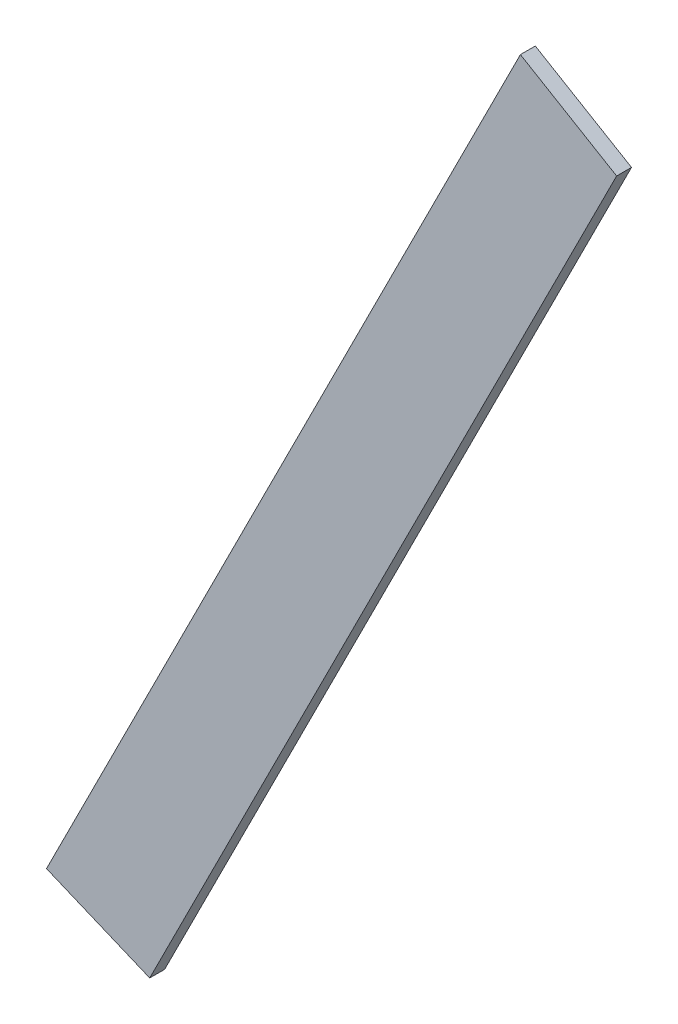
ISO-10303-21;
HEADER;
FILE_DESCRIPTION(('STEP AP214'),'2;1');
FILE_NAME('part.step','',(''),(''),'','','');
FILE_SCHEMA(('AUTOMOTIVE_DESIGN { 1 0 10303 214 1 1 1 1 }'));
ENDSEC;
DATA;
#1=APPLICATION_CONTEXT('core data for automotive mechanical design processes');
#2=APPLICATION_PROTOCOL_DEFINITION('international standard','automotive_design',2000,#1);
#3=PRODUCT_CONTEXT('',#1,'mechanical');
#4=PRODUCT('Part','Part','',(#3));
#5=PRODUCT_RELATED_PRODUCT_CATEGORY('part','',(#4));
#6=PRODUCT_DEFINITION_FORMATION('','',#4);
#7=PRODUCT_DEFINITION_CONTEXT('part definition',#1,'design');
#8=PRODUCT_DEFINITION('design','',#6,#7);
#9=PRODUCT_DEFINITION_SHAPE('','',#8);
#10=(LENGTH_UNIT() NAMED_UNIT(*) SI_UNIT(.MILLI.,.METRE.));
#11=(NAMED_UNIT(*) PLANE_ANGLE_UNIT() SI_UNIT($,.RADIAN.));
#12=(NAMED_UNIT(*) SI_UNIT($,.STERADIAN.) SOLID_ANGLE_UNIT());
#13=UNCERTAINTY_MEASURE_WITH_UNIT(LENGTH_MEASURE(1.E-05),#10,'distance_accuracy_value','');
#14=(GEOMETRIC_REPRESENTATION_CONTEXT(3) GLOBAL_UNCERTAINTY_ASSIGNED_CONTEXT((#13)) GLOBAL_UNIT_ASSIGNED_CONTEXT((#10,
#11,#12)) REPRESENTATION_CONTEXT('',''));
#15=CARTESIAN_POINT('',(0.,0.,0.));
#16=DIRECTION('',(0.,0.,1.));
#17=DIRECTION('',(1.,0.,0.));
#18=AXIS2_PLACEMENT_3D('',#15,#16,#17);
#19=CARTESIAN_POINT('',(31.4175872037386,-12.775658974795,2.));
#20=DIRECTION('',(-0.893304928541923,0.449451114853117,0.));
#21=DIRECTION('',(-0.449451114853117,-0.893304928541923,0.));
#22=AXIS2_PLACEMENT_3D('',#19,#20,#21);
#23=PLANE('',#22);
#24=DIRECTION('',(0.449451114853117,0.893304928541923,0.));
#25=VECTOR('',#24,1.);
#26=CARTESIAN_POINT('',(31.4175872037386,-12.775658974795,0.));
#27=LINE('',#26,#25);
#28=CARTESIAN_POINT('',(31.4175872037386,-12.775658974795,0.));
#29=VERTEX_POINT('',#28);
#30=CARTESIAN_POINT('',(94.186115232343,111.97970060107,0.));
#31=VERTEX_POINT('',#30);
#32=EDGE_CURVE('E96',#29,#31,#27,.T.);
#33=ORIENTED_EDGE('',*,*,#32,.T.);
#34=DIRECTION('',(0.,0.,-1.));
#35=VECTOR('',#34,1.);
#36=CARTESIAN_POINT('',(94.186115232343,111.97970060107,2.));
#37=LINE('',#36,#35);
#38=CARTESIAN_POINT('',(94.186115232343,111.97970060107,2.));
#39=VERTEX_POINT('',#38);
#40=EDGE_CURVE('E11',#39,#31,#37,.T.);
#41=ORIENTED_EDGE('',*,*,#40,.F.);
#42=DIRECTION('',(0.449451114853117,0.893304928541923,0.));
#43=VECTOR('',#42,1.);
#44=CARTESIAN_POINT('',(31.4175872037386,-12.775658974795,2.));
#45=LINE('',#44,#43);
#46=CARTESIAN_POINT('',(31.4175872037386,-12.775658974795,2.));
#47=VERTEX_POINT('',#46);
#48=EDGE_CURVE('E84',#47,#39,#45,.T.);
#49=ORIENTED_EDGE('',*,*,#48,.F.);
#50=DIRECTION('',(0.,0.,-1.));
#51=VECTOR('',#50,1.);
#52=CARTESIAN_POINT('',(31.4175872037386,-12.775658974795,2.));
#53=LINE('',#52,#51);
#54=EDGE_CURVE('E92',#47,#29,#53,.T.);
#55=ORIENTED_EDGE('',*,*,#54,.T.);
#56=EDGE_LOOP('',(#33,#41,#49,#55));
#57=FACE_BOUND('',#56,.T.);
#58=ADVANCED_FACE('F33',(#57),#23,.F.);
#59=CARTESIAN_POINT('',(94.186115232343,111.97970060107,2.));
#60=DIRECTION('',(-0.509923374683296,-0.86021982769034,0.));
#61=DIRECTION('',(0.86021982769034,-0.509923374683296,0.));
#62=AXIS2_PLACEMENT_3D('',#59,#60,#61);
#63=PLANE('',#62);
#64=DIRECTION('',(-0.86021982769034,0.509923374683296,0.));
#65=VECTOR('',#64,1.);
#66=CARTESIAN_POINT('',(94.186115232343,111.97970060107,0.));
#67=LINE('',#66,#65);
#68=CARTESIAN_POINT('',(81.2520896887023,119.646766322122,0.));
#69=VERTEX_POINT('',#68);
#70=EDGE_CURVE('E88',#31,#69,#67,.T.);
#71=ORIENTED_EDGE('',*,*,#70,.T.);
#72=DIRECTION('',(0.,0.,-1.));
#73=VECTOR('',#72,1.);
#74=CARTESIAN_POINT('',(81.2520896887023,119.646766322122,2.));
#75=LINE('',#74,#73);
#76=CARTESIAN_POINT('',(81.2520896887023,119.646766322122,2.));
#77=VERTEX_POINT('',#76);
#78=EDGE_CURVE('E41',#77,#69,#75,.T.);
#79=ORIENTED_EDGE('',*,*,#78,.F.);
#80=DIRECTION('',(-0.86021982769034,0.509923374683296,0.));
#81=VECTOR('',#80,1.);
#82=CARTESIAN_POINT('',(94.186115232343,111.97970060107,2.));
#83=LINE('',#82,#81);
#84=EDGE_CURVE('E79',#39,#77,#83,.T.);
#85=ORIENTED_EDGE('',*,*,#84,.F.);
#86=ORIENTED_EDGE('',*,*,#40,.T.);
#87=EDGE_LOOP('',(#71,#79,#85,#86));
#88=FACE_BOUND('',#87,.T.);
#89=ADVANCED_FACE('F87',(#88),#63,.F.);
#90=CARTESIAN_POINT('',(17.5407004382396,-6.98257364578779,2.));
#91=DIRECTION('',(0.893304928541923,-0.449451114853117,0.));
#92=DIRECTION('',(0.449451114853117,0.893304928541923,0.));
#93=AXIS2_PLACEMENT_3D('',#90,#91,#92);
#94=PLANE('',#93);
#95=DIRECTION('',(-0.449451114853117,-0.893304928541923,0.));
#96=VECTOR('',#95,1.);
#97=CARTESIAN_POINT('',(17.5407004382396,-6.98257364578779,0.));
#98=LINE('',#97,#96);
#99=CARTESIAN_POINT('',(17.5407004382396,-6.98257364578779,0.));
#100=VERTEX_POINT('',#99);
#101=EDGE_CURVE('E66',#69,#100,#98,.T.);
#102=ORIENTED_EDGE('',*,*,#101,.T.);
#103=DIRECTION('',(0.,0.,-1.));
#104=VECTOR('',#103,1.);
#105=CARTESIAN_POINT('',(17.5407004382396,-6.98257364578779,2.));
#106=LINE('',#105,#104);
#107=CARTESIAN_POINT('',(17.5407004382396,-6.98257364578779,2.));
#108=VERTEX_POINT('',#107);
#109=EDGE_CURVE('E89',#108,#100,#106,.T.);
#110=ORIENTED_EDGE('',*,*,#109,.F.);
#111=DIRECTION('',(-0.449451114853117,-0.893304928541923,0.));
#112=VECTOR('',#111,1.);
#113=CARTESIAN_POINT('',(17.5407004382396,-6.98257364578779,2.));
#114=LINE('',#113,#112);
#115=EDGE_CURVE('E82',#77,#108,#114,.T.);
#116=ORIENTED_EDGE('',*,*,#115,.F.);
#117=ORIENTED_EDGE('',*,*,#78,.T.);
#118=EDGE_LOOP('',(#102,#110,#116,#117));
#119=FACE_BOUND('',#118,.T.);
#120=ADVANCED_FACE('F90',(#119),#94,.F.);
#121=CARTESIAN_POINT('',(31.4175872037386,-12.775658974795,2.));
#122=DIRECTION('',(0.385241374526826,0.92281584476681,0.));
#123=DIRECTION('',(-0.92281584476681,0.385241374526826,0.));
#124=AXIS2_PLACEMENT_3D('',#121,#122,#123);
#125=PLANE('',#124);
#126=DIRECTION('',(0.92281584476681,-0.385241374526826,0.));
#127=VECTOR('',#126,1.);
#128=CARTESIAN_POINT('',(31.4175872037386,-12.775658974795,0.));
#129=LINE('',#128,#127);
#130=EDGE_CURVE('E72',#100,#29,#129,.T.);
#131=ORIENTED_EDGE('',*,*,#130,.T.);
#132=ORIENTED_EDGE('',*,*,#54,.F.);
#133=DIRECTION('',(0.92281584476681,-0.385241374526826,0.));
#134=VECTOR('',#133,1.);
#135=CARTESIAN_POINT('',(31.4175872037386,-12.775658974795,2.));
#136=LINE('',#135,#134);
#137=EDGE_CURVE('E49',#108,#47,#136,.T.);
#138=ORIENTED_EDGE('',*,*,#137,.F.);
#139=ORIENTED_EDGE('',*,*,#109,.T.);
#140=EDGE_LOOP('',(#131,#132,#138,#139));
#141=FACE_BOUND('',#140,.T.);
#142=ADVANCED_FACE('F103',(#141),#125,.F.);
#143=CARTESIAN_POINT('',(0.,0.,2.));
#144=DIRECTION('',(0.,0.,1.));
#145=DIRECTION('',(1.,0.,0.));
#146=AXIS2_PLACEMENT_3D('',#143,#144,#145);
#147=PLANE('',#146);
#148=ORIENTED_EDGE('',*,*,#48,.T.);
#149=ORIENTED_EDGE('',*,*,#84,.T.);
#150=ORIENTED_EDGE('',*,*,#115,.T.);
#151=ORIENTED_EDGE('',*,*,#137,.T.);
#152=EDGE_LOOP('',(#148,#149,#150,#151));
#153=FACE_BOUND('',#152,.T.);
#154=ADVANCED_FACE('F80',(#153),#147,.T.);
#155=CARTESIAN_POINT('',(0.,0.,0.));
#156=DIRECTION('',(0.,0.,1.));
#157=DIRECTION('',(1.,0.,0.));
#158=AXIS2_PLACEMENT_3D('',#155,#156,#157);
#159=PLANE('',#158);
#160=ORIENTED_EDGE('',*,*,#32,.F.);
#161=ORIENTED_EDGE('',*,*,#130,.F.);
#162=ORIENTED_EDGE('',*,*,#101,.F.);
#163=ORIENTED_EDGE('',*,*,#70,.F.);
#164=EDGE_LOOP('',(#160,#161,#162,#163));
#165=FACE_BOUND('',#164,.T.);
#166=ADVANCED_FACE('F106',(#165),#159,.F.);
#167=CLOSED_SHELL('',(#58,#89,#120,#142,#154,#166));
#168=MANIFOLD_SOLID_BREP('B2',#167);
#169=ADVANCED_BREP_SHAPE_REPRESENTATION('',(#18,#168),#14);
#170=SHAPE_DEFINITION_REPRESENTATION(#9,#169);
ENDSEC;
END-ISO-10303-21;
